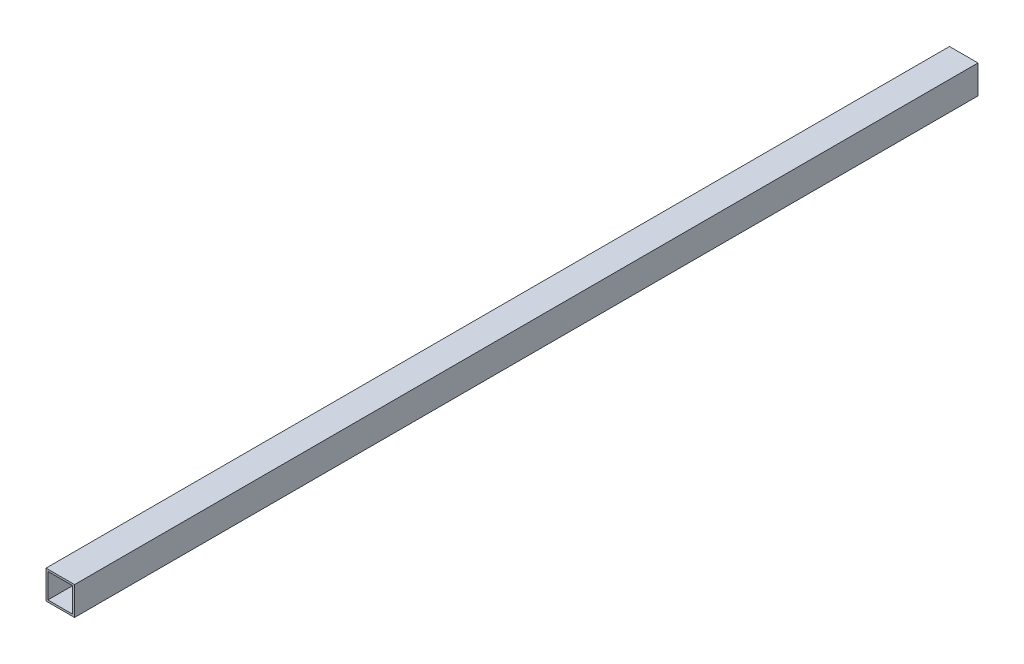
ISO-10303-21;
HEADER;
FILE_DESCRIPTION(('STEP AP214'),'2;1');
FILE_NAME('part.step','',(''),(''),'','','');
FILE_SCHEMA(('AUTOMOTIVE_DESIGN { 1 0 10303 214 1 1 1 1 }'));
ENDSEC;
DATA;
#1=APPLICATION_CONTEXT('core data for automotive mechanical design processes');
#2=APPLICATION_PROTOCOL_DEFINITION('international standard','automotive_design',2000,#1);
#3=PRODUCT_CONTEXT('',#1,'mechanical');
#4=PRODUCT('Part','Part','',(#3));
#5=PRODUCT_RELATED_PRODUCT_CATEGORY('part','',(#4));
#6=PRODUCT_DEFINITION_FORMATION('','',#4);
#7=PRODUCT_DEFINITION_CONTEXT('part definition',#1,'design');
#8=PRODUCT_DEFINITION('design','',#6,#7);
#9=PRODUCT_DEFINITION_SHAPE('','',#8);
#10=(LENGTH_UNIT() NAMED_UNIT(*) SI_UNIT(.MILLI.,.METRE.));
#11=(NAMED_UNIT(*) PLANE_ANGLE_UNIT() SI_UNIT($,.RADIAN.));
#12=(NAMED_UNIT(*) SI_UNIT($,.STERADIAN.) SOLID_ANGLE_UNIT());
#13=UNCERTAINTY_MEASURE_WITH_UNIT(LENGTH_MEASURE(1.E-05),#10,'distance_accuracy_value','');
#14=(GEOMETRIC_REPRESENTATION_CONTEXT(3) GLOBAL_UNCERTAINTY_ASSIGNED_CONTEXT((#13)) GLOBAL_UNIT_ASSIGNED_CONTEXT((#10,
#11,#12)) REPRESENTATION_CONTEXT('',''));
#15=CARTESIAN_POINT('',(0.,0.,0.));
#16=DIRECTION('',(0.,0.,1.));
#17=DIRECTION('',(1.,0.,0.));
#18=AXIS2_PLACEMENT_3D('',#15,#16,#17);
#19=CARTESIAN_POINT('',(-15.,-15.,950.));
#20=DIRECTION('',(0.,0.,1.));
#21=DIRECTION('',(1.,0.,0.));
#22=AXIS2_PLACEMENT_3D('',#19,#20,#21);
#23=PLANE('',#22);
#24=DIRECTION('',(0.,-1.,0.));
#25=VECTOR('',#24,1.);
#26=CARTESIAN_POINT('',(-15.,-15.,950.));
#27=LINE('',#26,#25);
#28=CARTESIAN_POINT('',(-15.,15.,950.));
#29=VERTEX_POINT('',#28);
#30=CARTESIAN_POINT('',(-15.,-15.,950.));
#31=VERTEX_POINT('',#30);
#32=EDGE_CURVE('E156',#29,#31,#27,.T.);
#33=ORIENTED_EDGE('',*,*,#32,.T.);
#34=DIRECTION('',(1.,0.,0.));
#35=VECTOR('',#34,1.);
#36=CARTESIAN_POINT('',(15.,-15.,950.));
#37=LINE('',#36,#35);
#38=CARTESIAN_POINT('',(15.,-15.,950.));
#39=VERTEX_POINT('',#38);
#40=EDGE_CURVE('E159',#31,#39,#37,.T.);
#41=ORIENTED_EDGE('',*,*,#40,.T.);
#42=DIRECTION('',(0.,1.,0.));
#43=VECTOR('',#42,1.);
#44=CARTESIAN_POINT('',(15.,-15.,950.));
#45=LINE('',#44,#43);
#46=CARTESIAN_POINT('',(15.,15.,950.));
#47=VERTEX_POINT('',#46);
#48=EDGE_CURVE('E162',#39,#47,#45,.T.);
#49=ORIENTED_EDGE('',*,*,#48,.T.);
#50=DIRECTION('',(-1.,0.,0.));
#51=VECTOR('',#50,1.);
#52=CARTESIAN_POINT('',(15.,15.,950.));
#53=LINE('',#52,#51);
#54=EDGE_CURVE('E164',#47,#29,#53,.T.);
#55=ORIENTED_EDGE('',*,*,#54,.T.);
#56=EDGE_LOOP('',(#33,#41,#49,#55));
#57=FACE_BOUND('',#56,.T.);
#58=DIRECTION('',(1.,0.,0.));
#59=VECTOR('',#58,1.);
#60=CARTESIAN_POINT('',(15.,-13.,950.));
#61=LINE('',#60,#59);
#62=CARTESIAN_POINT('',(-13.,-13.,950.));
#63=VERTEX_POINT('',#62);
#64=CARTESIAN_POINT('',(13.,-13.,950.));
#65=VERTEX_POINT('',#64);
#66=EDGE_CURVE('E128',#63,#65,#61,.T.);
#67=ORIENTED_EDGE('',*,*,#66,.F.);
#68=DIRECTION('',(0.,-1.,0.));
#69=VECTOR('',#68,1.);
#70=CARTESIAN_POINT('',(-13.,-15.,950.));
#71=LINE('',#70,#69);
#72=CARTESIAN_POINT('',(-13.,13.,950.));
#73=VERTEX_POINT('',#72);
#74=EDGE_CURVE('E120',#73,#63,#71,.T.);
#75=ORIENTED_EDGE('',*,*,#74,.F.);
#76=DIRECTION('',(-1.,0.,0.));
#77=VECTOR('',#76,1.);
#78=CARTESIAN_POINT('',(15.,13.,950.));
#79=LINE('',#78,#77);
#80=CARTESIAN_POINT('',(13.,13.,950.));
#81=VERTEX_POINT('',#80);
#82=EDGE_CURVE('E142',#81,#73,#79,.T.);
#83=ORIENTED_EDGE('',*,*,#82,.F.);
#84=DIRECTION('',(0.,1.,0.));
#85=VECTOR('',#84,1.);
#86=CARTESIAN_POINT('',(13.,-15.,950.));
#87=LINE('',#86,#85);
#88=EDGE_CURVE('E140',#65,#81,#87,.T.);
#89=ORIENTED_EDGE('',*,*,#88,.F.);
#90=EDGE_LOOP('',(#67,#75,#83,#89));
#91=FACE_BOUND('',#90,.T.);
#92=ADVANCED_FACE('F55',(#57,#91),#23,.T.);
#93=CARTESIAN_POINT('',(-15.,-15.,0.));
#94=DIRECTION('',(0.,0.,1.));
#95=DIRECTION('',(1.,0.,0.));
#96=AXIS2_PLACEMENT_3D('',#93,#94,#95);
#97=PLANE('',#96);
#98=DIRECTION('',(0.,-1.,0.));
#99=VECTOR('',#98,1.);
#100=CARTESIAN_POINT('',(-15.,-15.,0.));
#101=LINE('',#100,#99);
#102=CARTESIAN_POINT('',(-15.,15.,0.));
#103=VERTEX_POINT('',#102);
#104=CARTESIAN_POINT('',(-15.,-15.,0.));
#105=VERTEX_POINT('',#104);
#106=EDGE_CURVE('E136',#103,#105,#101,.T.);
#107=ORIENTED_EDGE('',*,*,#106,.F.);
#108=DIRECTION('',(-1.,0.,0.));
#109=VECTOR('',#108,1.);
#110=CARTESIAN_POINT('',(15.,15.,0.));
#111=LINE('',#110,#109);
#112=CARTESIAN_POINT('',(15.,15.,0.));
#113=VERTEX_POINT('',#112);
#114=EDGE_CURVE('E160',#113,#103,#111,.T.);
#115=ORIENTED_EDGE('',*,*,#114,.F.);
#116=DIRECTION('',(0.,1.,0.));
#117=VECTOR('',#116,1.);
#118=CARTESIAN_POINT('',(15.,-15.,0.));
#119=LINE('',#118,#117);
#120=CARTESIAN_POINT('',(15.,-15.,0.));
#121=VERTEX_POINT('',#120);
#122=EDGE_CURVE('E171',#121,#113,#119,.T.);
#123=ORIENTED_EDGE('',*,*,#122,.F.);
#124=DIRECTION('',(1.,0.,0.));
#125=VECTOR('',#124,1.);
#126=CARTESIAN_POINT('',(15.,-15.,0.));
#127=LINE('',#126,#125);
#128=EDGE_CURVE('E169',#105,#121,#127,.T.);
#129=ORIENTED_EDGE('',*,*,#128,.F.);
#130=EDGE_LOOP('',(#107,#115,#123,#129));
#131=FACE_BOUND('',#130,.T.);
#132=DIRECTION('',(0.,-1.,0.));
#133=VECTOR('',#132,1.);
#134=CARTESIAN_POINT('',(-13.,-15.,0.));
#135=LINE('',#134,#133);
#136=CARTESIAN_POINT('',(-13.,13.,0.));
#137=VERTEX_POINT('',#136);
#138=CARTESIAN_POINT('',(-13.,-13.,0.));
#139=VERTEX_POINT('',#138);
#140=EDGE_CURVE('E78',#137,#139,#135,.T.);
#141=ORIENTED_EDGE('',*,*,#140,.T.);
#142=DIRECTION('',(1.,0.,0.));
#143=VECTOR('',#142,1.);
#144=CARTESIAN_POINT('',(15.,-13.,0.));
#145=LINE('',#144,#143);
#146=CARTESIAN_POINT('',(13.,-13.,0.));
#147=VERTEX_POINT('',#146);
#148=EDGE_CURVE('E135',#139,#147,#145,.T.);
#149=ORIENTED_EDGE('',*,*,#148,.T.);
#150=DIRECTION('',(0.,1.,0.));
#151=VECTOR('',#150,1.);
#152=CARTESIAN_POINT('',(13.,-15.,0.));
#153=LINE('',#152,#151);
#154=CARTESIAN_POINT('',(13.,13.,0.));
#155=VERTEX_POINT('',#154);
#156=EDGE_CURVE('E148',#147,#155,#153,.T.);
#157=ORIENTED_EDGE('',*,*,#156,.T.);
#158=DIRECTION('',(-1.,0.,0.));
#159=VECTOR('',#158,1.);
#160=CARTESIAN_POINT('',(15.,13.,0.));
#161=LINE('',#160,#159);
#162=EDGE_CURVE('E129',#155,#137,#161,.T.);
#163=ORIENTED_EDGE('',*,*,#162,.T.);
#164=EDGE_LOOP('',(#141,#149,#157,#163));
#165=FACE_BOUND('',#164,.T.);
#166=ADVANCED_FACE('F189',(#131,#165),#97,.F.);
#167=CARTESIAN_POINT('',(-15.,-15.,950.));
#168=DIRECTION('',(1.,0.,0.));
#169=DIRECTION('',(0.,0.,-1.));
#170=AXIS2_PLACEMENT_3D('',#167,#168,#169);
#171=PLANE('',#170);
#172=ORIENTED_EDGE('',*,*,#106,.T.);
#173=DIRECTION('',(0.,0.,-1.));
#174=VECTOR('',#173,1.);
#175=CARTESIAN_POINT('',(-15.,-15.,950.));
#176=LINE('',#175,#174);
#177=EDGE_CURVE('E12',#31,#105,#176,.T.);
#178=ORIENTED_EDGE('',*,*,#177,.F.);
#179=ORIENTED_EDGE('',*,*,#32,.F.);
#180=DIRECTION('',(0.,0.,-1.));
#181=VECTOR('',#180,1.);
#182=CARTESIAN_POINT('',(-15.,15.,950.));
#183=LINE('',#182,#181);
#184=EDGE_CURVE('E166',#29,#103,#183,.T.);
#185=ORIENTED_EDGE('',*,*,#184,.T.);
#186=EDGE_LOOP('',(#172,#178,#179,#185));
#187=FACE_BOUND('',#186,.T.);
#188=ADVANCED_FACE('F57',(#187),#171,.F.);
#189=CARTESIAN_POINT('',(15.,-15.,950.));
#190=DIRECTION('',(0.,1.,0.));
#191=DIRECTION('',(-1.,0.,0.));
#192=AXIS2_PLACEMENT_3D('',#189,#190,#191);
#193=PLANE('',#192);
#194=ORIENTED_EDGE('',*,*,#128,.T.);
#195=DIRECTION('',(0.,0.,-1.));
#196=VECTOR('',#195,1.);
#197=CARTESIAN_POINT('',(15.,-15.,950.));
#198=LINE('',#197,#196);
#199=EDGE_CURVE('E63',#39,#121,#198,.T.);
#200=ORIENTED_EDGE('',*,*,#199,.F.);
#201=ORIENTED_EDGE('',*,*,#40,.F.);
#202=ORIENTED_EDGE('',*,*,#177,.T.);
#203=EDGE_LOOP('',(#194,#200,#201,#202));
#204=FACE_BOUND('',#203,.T.);
#205=ADVANCED_FACE('F199',(#204),#193,.F.);
#206=CARTESIAN_POINT('',(15.,-15.,950.));
#207=DIRECTION('',(-1.,0.,0.));
#208=DIRECTION('',(0.,0.,1.));
#209=AXIS2_PLACEMENT_3D('',#206,#207,#208);
#210=PLANE('',#209);
#211=ORIENTED_EDGE('',*,*,#122,.T.);
#212=DIRECTION('',(0.,0.,-1.));
#213=VECTOR('',#212,1.);
#214=CARTESIAN_POINT('',(15.,15.,950.));
#215=LINE('',#214,#213);
#216=EDGE_CURVE('E176',#47,#113,#215,.T.);
#217=ORIENTED_EDGE('',*,*,#216,.F.);
#218=ORIENTED_EDGE('',*,*,#48,.F.);
#219=ORIENTED_EDGE('',*,*,#199,.T.);
#220=EDGE_LOOP('',(#211,#217,#218,#219));
#221=FACE_BOUND('',#220,.T.);
#222=ADVANCED_FACE('F183',(#221),#210,.F.);
#223=CARTESIAN_POINT('',(15.,15.,950.));
#224=DIRECTION('',(0.,-1.,0.));
#225=DIRECTION('',(1.,0.,0.));
#226=AXIS2_PLACEMENT_3D('',#223,#224,#225);
#227=PLANE('',#226);
#228=ORIENTED_EDGE('',*,*,#114,.T.);
#229=ORIENTED_EDGE('',*,*,#184,.F.);
#230=ORIENTED_EDGE('',*,*,#54,.F.);
#231=ORIENTED_EDGE('',*,*,#216,.T.);
#232=EDGE_LOOP('',(#228,#229,#230,#231));
#233=FACE_BOUND('',#232,.T.);
#234=ADVANCED_FACE('F193',(#233),#227,.F.);
#235=CARTESIAN_POINT('',(-13.,-15.,950.));
#236=DIRECTION('',(1.,0.,0.));
#237=DIRECTION('',(0.,0.,-1.));
#238=AXIS2_PLACEMENT_3D('',#235,#236,#237);
#239=PLANE('',#238);
#240=ORIENTED_EDGE('',*,*,#140,.F.);
#241=DIRECTION('',(0.,0.,-1.));
#242=VECTOR('',#241,1.);
#243=CARTESIAN_POINT('',(-13.,13.,950.));
#244=LINE('',#243,#242);
#245=EDGE_CURVE('E124',#73,#137,#244,.T.);
#246=ORIENTED_EDGE('',*,*,#245,.F.);
#247=ORIENTED_EDGE('',*,*,#74,.T.);
#248=DIRECTION('',(0.,0.,-1.));
#249=VECTOR('',#248,1.);
#250=CARTESIAN_POINT('',(-13.,-13.,950.));
#251=LINE('',#250,#249);
#252=EDGE_CURVE('E123',#63,#139,#251,.T.);
#253=ORIENTED_EDGE('',*,*,#252,.T.);
#254=EDGE_LOOP('',(#240,#246,#247,#253));
#255=FACE_BOUND('',#254,.T.);
#256=ADVANCED_FACE('F122',(#255),#239,.T.);
#257=CARTESIAN_POINT('',(15.,-13.,950.));
#258=DIRECTION('',(0.,1.,0.));
#259=DIRECTION('',(-1.,0.,0.));
#260=AXIS2_PLACEMENT_3D('',#257,#258,#259);
#261=PLANE('',#260);
#262=ORIENTED_EDGE('',*,*,#148,.F.);
#263=ORIENTED_EDGE('',*,*,#252,.F.);
#264=ORIENTED_EDGE('',*,*,#66,.T.);
#265=DIRECTION('',(0.,0.,-1.));
#266=VECTOR('',#265,1.);
#267=CARTESIAN_POINT('',(13.,-13.,950.));
#268=LINE('',#267,#266);
#269=EDGE_CURVE('E137',#65,#147,#268,.T.);
#270=ORIENTED_EDGE('',*,*,#269,.T.);
#271=EDGE_LOOP('',(#262,#263,#264,#270));
#272=FACE_BOUND('',#271,.T.);
#273=ADVANCED_FACE('F132',(#272),#261,.T.);
#274=CARTESIAN_POINT('',(13.,-15.,950.));
#275=DIRECTION('',(-1.,0.,0.));
#276=DIRECTION('',(0.,0.,1.));
#277=AXIS2_PLACEMENT_3D('',#274,#275,#276);
#278=PLANE('',#277);
#279=ORIENTED_EDGE('',*,*,#156,.F.);
#280=ORIENTED_EDGE('',*,*,#269,.F.);
#281=ORIENTED_EDGE('',*,*,#88,.T.);
#282=DIRECTION('',(0.,0.,-1.));
#283=VECTOR('',#282,1.);
#284=CARTESIAN_POINT('',(13.,13.,950.));
#285=LINE('',#284,#283);
#286=EDGE_CURVE('E70',#81,#155,#285,.T.);
#287=ORIENTED_EDGE('',*,*,#286,.T.);
#288=EDGE_LOOP('',(#279,#280,#281,#287));
#289=FACE_BOUND('',#288,.T.);
#290=ADVANCED_FACE('F222',(#289),#278,.T.);
#291=CARTESIAN_POINT('',(15.,13.,950.));
#292=DIRECTION('',(0.,-1.,0.));
#293=DIRECTION('',(1.,0.,0.));
#294=AXIS2_PLACEMENT_3D('',#291,#292,#293);
#295=PLANE('',#294);
#296=ORIENTED_EDGE('',*,*,#162,.F.);
#297=ORIENTED_EDGE('',*,*,#286,.F.);
#298=ORIENTED_EDGE('',*,*,#82,.T.);
#299=ORIENTED_EDGE('',*,*,#245,.T.);
#300=EDGE_LOOP('',(#296,#297,#298,#299));
#301=FACE_BOUND('',#300,.T.);
#302=ADVANCED_FACE('F226',(#301),#295,.T.);
#303=CLOSED_SHELL('',(#92,#166,#188,#205,#222,#234,#256,#273,#290,#302));
#304=MANIFOLD_SOLID_BREP('B2',#303);
#305=ADVANCED_BREP_SHAPE_REPRESENTATION('',(#18,#304),#14);
#306=SHAPE_DEFINITION_REPRESENTATION(#9,#305);
ENDSEC;
END-ISO-10303-21;
